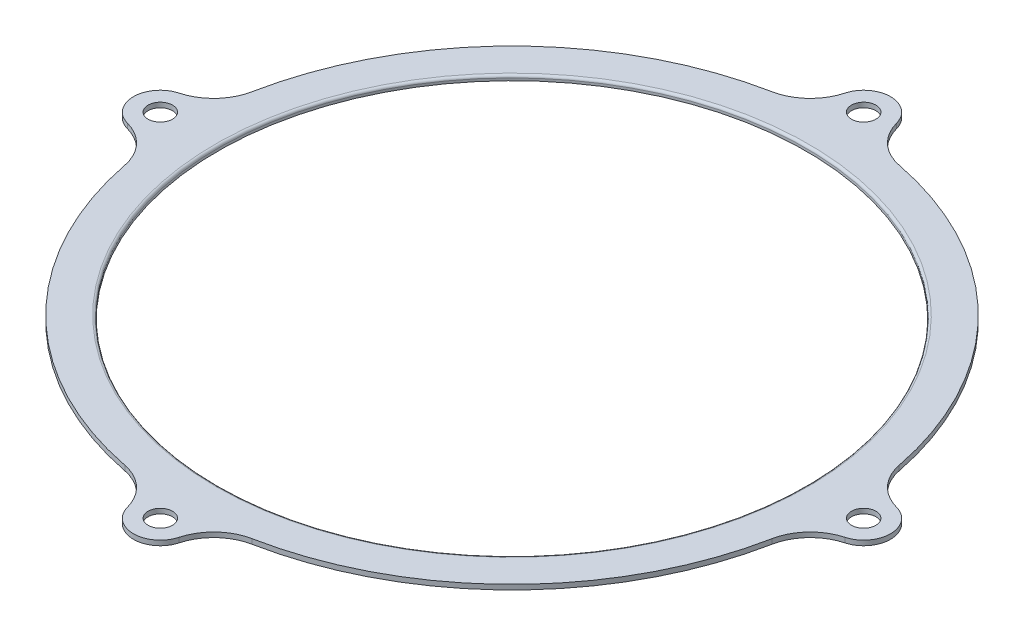
ISO-10303-21;
HEADER;
FILE_DESCRIPTION(('STEP AP214'),'2;1');
FILE_NAME('part.step','',(''),(''),'','','');
FILE_SCHEMA(('AUTOMOTIVE_DESIGN { 1 0 10303 214 1 1 1 1 }'));
ENDSEC;
DATA;
#1=APPLICATION_CONTEXT('core data for automotive mechanical design processes');
#2=APPLICATION_PROTOCOL_DEFINITION('international standard','automotive_design',2000,#1);
#3=PRODUCT_CONTEXT('',#1,'mechanical');
#4=PRODUCT('Part','Part','',(#3));
#5=PRODUCT_RELATED_PRODUCT_CATEGORY('part','',(#4));
#6=PRODUCT_DEFINITION_FORMATION('','',#4);
#7=PRODUCT_DEFINITION_CONTEXT('part definition',#1,'design');
#8=PRODUCT_DEFINITION('design','',#6,#7);
#9=PRODUCT_DEFINITION_SHAPE('','',#8);
#10=(LENGTH_UNIT() NAMED_UNIT(*) SI_UNIT(.MILLI.,.METRE.));
#11=(NAMED_UNIT(*) PLANE_ANGLE_UNIT() SI_UNIT($,.RADIAN.));
#12=(NAMED_UNIT(*) SI_UNIT($,.STERADIAN.) SOLID_ANGLE_UNIT());
#13=UNCERTAINTY_MEASURE_WITH_UNIT(LENGTH_MEASURE(1.E-05),#10,'distance_accuracy_value','');
#14=(GEOMETRIC_REPRESENTATION_CONTEXT(3) GLOBAL_UNCERTAINTY_ASSIGNED_CONTEXT((#13)) GLOBAL_UNIT_ASSIGNED_CONTEXT((#10,
#11,#12)) REPRESENTATION_CONTEXT('',''));
#15=CARTESIAN_POINT('',(0.,0.,0.));
#16=DIRECTION('',(0.,0.,1.));
#17=DIRECTION('',(1.,0.,0.));
#18=AXIS2_PLACEMENT_3D('',#15,#16,#17);
#19=CARTESIAN_POINT('',(0.,1.,0.));
#20=DIRECTION('',(0.,-1.,0.));
#21=DIRECTION('',(0.,0.,-1.));
#22=AXIS2_PLACEMENT_3D('',#19,#20,#21);
#23=CYLINDRICAL_SURFACE('',#22,67.5);
#24=DIRECTION('',(0.,-1.,0.));
#25=VECTOR('',#24,1.);
#26=CARTESIAN_POINT('',(-13.0329760411857,199.116127561589,66.2298387096774));
#27=LINE('',#26,#25);
#28=CARTESIAN_POINT('',(-13.0329760411857,1.,66.2298387096774));
#29=VERTEX_POINT('',#28);
#30=CARTESIAN_POINT('',(-13.0329760411857,0.,66.2298387096774));
#31=VERTEX_POINT('',#30);
#32=EDGE_CURVE('E249',#29,#31,#27,.T.);
#33=ORIENTED_EDGE('',*,*,#32,.F.);
#34=CARTESIAN_POINT('',(0.,1.,0.));
#35=DIRECTION('',(0.,1.,0.));
#36=DIRECTION('',(0.,0.,1.));
#37=AXIS2_PLACEMENT_3D('',#34,#35,#36);
#38=CIRCLE('',#37,67.5);
#39=CARTESIAN_POINT('',(-66.2298387096774,1.,13.0329760411855));
#40=VERTEX_POINT('',#39);
#41=EDGE_CURVE('E350',#40,#29,#38,.T.);
#42=ORIENTED_EDGE('',*,*,#41,.F.);
#43=DIRECTION('',(0.,-1.,0.));
#44=VECTOR('',#43,1.);
#45=CARTESIAN_POINT('',(-66.2298387096774,199.116127561589,13.0329760411855));
#46=LINE('',#45,#44);
#47=CARTESIAN_POINT('',(-66.2298387096774,0.,13.0329760411855));
#48=VERTEX_POINT('',#47);
#49=EDGE_CURVE('E58',#40,#48,#46,.T.);
#50=ORIENTED_EDGE('',*,*,#49,.T.);
#51=CARTESIAN_POINT('',(0.,0.,0.));
#52=DIRECTION('',(0.,1.,0.));
#53=DIRECTION('',(0.,0.,1.));
#54=AXIS2_PLACEMENT_3D('',#51,#52,#53);
#55=CIRCLE('',#54,67.5);
#56=EDGE_CURVE('E360',#48,#31,#55,.T.);
#57=ORIENTED_EDGE('',*,*,#56,.T.);
#58=EDGE_LOOP('',(#33,#42,#50,#57));
#59=FACE_BOUND('',#58,.T.);
#60=ADVANCED_FACE('F43',(#59),#23,.T.);
#61=DIRECTION('',(0.,-1.,0.));
#62=VECTOR('',#61,1.);
#63=CARTESIAN_POINT('',(13.0329760411862,199.116127561589,-66.2298387096773));
#64=LINE('',#63,#62);
#65=CARTESIAN_POINT('',(13.0329760411862,1.,-66.2298387096773));
#66=VERTEX_POINT('',#65);
#67=CARTESIAN_POINT('',(13.0329760411862,0.,-66.2298387096773));
#68=VERTEX_POINT('',#67);
#69=EDGE_CURVE('E169',#66,#68,#64,.T.);
#70=ORIENTED_EDGE('',*,*,#69,.F.);
#71=CARTESIAN_POINT('',(66.2298387096774,1.,-13.0329760411855));
#72=VERTEX_POINT('',#71);
#73=EDGE_CURVE('E166',#72,#66,#38,.T.);
#74=ORIENTED_EDGE('',*,*,#73,.F.);
#75=DIRECTION('',(0.,-1.,0.));
#76=VECTOR('',#75,1.);
#77=CARTESIAN_POINT('',(66.2298387096774,199.116127561589,-13.0329760411855));
#78=LINE('',#77,#76);
#79=CARTESIAN_POINT('',(66.2298387096774,0.,-13.0329760411855));
#80=VERTEX_POINT('',#79);
#81=EDGE_CURVE('E288',#72,#80,#78,.T.);
#82=ORIENTED_EDGE('',*,*,#81,.T.);
#83=EDGE_CURVE('E295',#80,#68,#55,.T.);
#84=ORIENTED_EDGE('',*,*,#83,.T.);
#85=EDGE_LOOP('',(#70,#74,#82,#84));
#86=FACE_BOUND('',#85,.T.);
#87=ADVANCED_FACE('F317',(#86),#23,.T.);
#88=CARTESIAN_POINT('',(-13.0329760411848,1.,-66.2298387096776));
#89=VERTEX_POINT('',#88);
#90=CARTESIAN_POINT('',(-66.2298387096774,1.,-13.0329760411855));
#91=VERTEX_POINT('',#90);
#92=EDGE_CURVE('E301',#89,#91,#38,.T.);
#93=ORIENTED_EDGE('',*,*,#92,.F.);
#94=DIRECTION('',(0.,-1.,0.));
#95=VECTOR('',#94,1.);
#96=CARTESIAN_POINT('',(-13.0329760411848,199.116127561589,-66.2298387096776));
#97=LINE('',#96,#95);
#98=CARTESIAN_POINT('',(-13.0329760411848,0.,-66.2298387096776));
#99=VERTEX_POINT('',#98);
#100=EDGE_CURVE('E170',#89,#99,#97,.T.);
#101=ORIENTED_EDGE('',*,*,#100,.T.);
#102=CARTESIAN_POINT('',(-66.2298387096774,0.,-13.0329760411855));
#103=VERTEX_POINT('',#102);
#104=EDGE_CURVE('E298',#99,#103,#55,.T.);
#105=ORIENTED_EDGE('',*,*,#104,.T.);
#106=DIRECTION('',(0.,-1.,0.));
#107=VECTOR('',#106,1.);
#108=CARTESIAN_POINT('',(-66.2298387096774,199.116127561589,-13.0329760411855));
#109=LINE('',#108,#107);
#110=EDGE_CURVE('E216',#91,#103,#109,.T.);
#111=ORIENTED_EDGE('',*,*,#110,.F.);
#112=EDGE_LOOP('',(#93,#101,#105,#111));
#113=FACE_BOUND('',#112,.T.);
#114=ADVANCED_FACE('F323',(#113),#23,.T.);
#115=CARTESIAN_POINT('',(0.,1.,0.));
#116=DIRECTION('',(0.,1.,0.));
#117=DIRECTION('',(0.,0.,1.));
#118=AXIS2_PLACEMENT_3D('',#115,#116,#117);
#119=PLANE('',#118);
#120=CARTESIAN_POINT('',(0.,1.,0.));
#121=DIRECTION('',(0.,1.,0.));
#122=DIRECTION('',(0.,0.,1.));
#123=AXIS2_PLACEMENT_3D('',#120,#121,#122);
#124=CIRCLE('',#123,60.7);
#125=CARTESIAN_POINT('',(0.,1.,60.7));
#126=VERTEX_POINT('',#125);
#127=EDGE_CURVE('E51',#126,#126,#124,.F.);
#128=ORIENTED_EDGE('',*,*,#127,.T.);
#129=EDGE_LOOP('',(#128));
#130=FACE_BOUND('',#129,.T.);
#131=CARTESIAN_POINT('',(13.0329760411852,1.,66.2298387096775));
#132=VERTEX_POINT('',#131);
#133=CARTESIAN_POINT('',(66.2298387096774,1.,13.0329760411855));
#134=VERTEX_POINT('',#133);
#135=EDGE_CURVE('E277',#132,#134,#38,.T.);
#136=ORIENTED_EDGE('',*,*,#135,.T.);
#137=CARTESIAN_POINT('',(76.0416666666667,1.,14.9637873065463));
#138=DIRECTION('',(0.,1.,0.));
#139=DIRECTION('',(0.,0.,1.));
#140=AXIS2_PLACEMENT_3D('',#137,#138,#139);
#141=CIRCLE('',#140,10.);
#142=CARTESIAN_POINT('',(73.4341397849462,1.,5.30973097974223));
#143=VERTEX_POINT('',#142);
#144=EDGE_CURVE('E285',#143,#134,#141,.T.);
#145=ORIENTED_EDGE('',*,*,#144,.F.);
#146=CARTESIAN_POINT('',(72.,1.,0.));
#147=DIRECTION('',(0.,1.,0.));
#148=DIRECTION('',(0.,0.,1.));
#149=AXIS2_PLACEMENT_3D('',#146,#147,#148);
#150=CIRCLE('',#149,5.5);
#151=CARTESIAN_POINT('',(73.4341397849462,1.,-5.30973097974223));
#152=VERTEX_POINT('',#151);
#153=EDGE_CURVE('E278',#152,#143,#150,.F.);
#154=ORIENTED_EDGE('',*,*,#153,.F.);
#155=CARTESIAN_POINT('',(76.0416666666667,1.,-14.9637873065463));
#156=DIRECTION('',(0.,1.,0.));
#157=DIRECTION('',(0.,0.,1.));
#158=AXIS2_PLACEMENT_3D('',#155,#156,#157);
#159=CIRCLE('',#158,10.);
#160=EDGE_CURVE('E245',#72,#152,#159,.T.);
#161=ORIENTED_EDGE('',*,*,#160,.F.);
#162=ORIENTED_EDGE('',*,*,#73,.T.);
#163=CARTESIAN_POINT('',(14.9637873065471,1.,-76.0416666666665));
#164=DIRECTION('',(0.,1.,0.));
#165=DIRECTION('',(0.,0.,1.));
#166=AXIS2_PLACEMENT_3D('',#163,#164,#165);
#167=CIRCLE('',#166,10.);
#168=CARTESIAN_POINT('',(5.309730979743,1.,-73.4341397849462));
#169=VERTEX_POINT('',#168);
#170=EDGE_CURVE('E157',#169,#66,#167,.T.);
#171=ORIENTED_EDGE('',*,*,#170,.F.);
#172=CARTESIAN_POINT('',(7.54159969190117E-13,1.,-72.));
#173=DIRECTION('',(0.,1.,0.));
#174=DIRECTION('',(0.,0.,1.));
#175=AXIS2_PLACEMENT_3D('',#172,#173,#174);
#176=CIRCLE('',#175,5.5);
#177=CARTESIAN_POINT('',(-5.30973097974146,1.,-73.4341397849463));
#178=VERTEX_POINT('',#177);
#179=EDGE_CURVE('E162',#178,#169,#176,.F.);
#180=ORIENTED_EDGE('',*,*,#179,.F.);
#181=CARTESIAN_POINT('',(-14.9637873065455,1.,-76.0416666666668));
#182=DIRECTION('',(0.,1.,0.));
#183=DIRECTION('',(0.,0.,1.));
#184=AXIS2_PLACEMENT_3D('',#181,#182,#183);
#185=CIRCLE('',#184,10.);
#186=EDGE_CURVE('E191',#89,#178,#185,.T.);
#187=ORIENTED_EDGE('',*,*,#186,.F.);
#188=ORIENTED_EDGE('',*,*,#92,.T.);
#189=CARTESIAN_POINT('',(-76.0416666666667,1.,-14.9637873065463));
#190=DIRECTION('',(0.,1.,0.));
#191=DIRECTION('',(0.,0.,1.));
#192=AXIS2_PLACEMENT_3D('',#189,#190,#191);
#193=CIRCLE('',#192,10.);
#194=CARTESIAN_POINT('',(-73.4341397849462,1.,-5.30973097974223));
#195=VERTEX_POINT('',#194);
#196=EDGE_CURVE('E221',#195,#91,#193,.T.);
#197=ORIENTED_EDGE('',*,*,#196,.F.);
#198=CARTESIAN_POINT('',(-72.,1.,0.));
#199=DIRECTION('',(0.,1.,0.));
#200=DIRECTION('',(0.,0.,1.));
#201=AXIS2_PLACEMENT_3D('',#198,#199,#200);
#202=CIRCLE('',#201,5.5);
#203=CARTESIAN_POINT('',(-73.4341397849462,1.,5.30973097974223));
#204=VERTEX_POINT('',#203);
#205=EDGE_CURVE('E213',#204,#195,#202,.F.);
#206=ORIENTED_EDGE('',*,*,#205,.F.);
#207=CARTESIAN_POINT('',(-76.0416666666667,1.,14.9637873065463));
#208=DIRECTION('',(0.,1.,0.));
#209=DIRECTION('',(0.,0.,1.));
#210=AXIS2_PLACEMENT_3D('',#207,#208,#209);
#211=CIRCLE('',#210,10.);
#212=EDGE_CURVE('E217',#40,#204,#211,.T.);
#213=ORIENTED_EDGE('',*,*,#212,.F.);
#214=ORIENTED_EDGE('',*,*,#41,.T.);
#215=CARTESIAN_POINT('',(-14.9637873065465,1.,76.0416666666666));
#216=DIRECTION('',(0.,1.,0.));
#217=DIRECTION('',(0.,0.,1.));
#218=AXIS2_PLACEMENT_3D('',#215,#216,#217);
#219=CIRCLE('',#218,10.);
#220=CARTESIAN_POINT('',(-5.30973097974249,1.,73.4341397849462));
#221=VERTEX_POINT('',#220);
#222=EDGE_CURVE('E253',#221,#29,#219,.T.);
#223=ORIENTED_EDGE('',*,*,#222,.F.);
#224=CARTESIAN_POINT('',(-2.51386656396706E-13,1.,72.));
#225=DIRECTION('',(0.,1.,0.));
#226=DIRECTION('',(0.,0.,1.));
#227=AXIS2_PLACEMENT_3D('',#224,#225,#226);
#228=CIRCLE('',#227,5.5);
#229=CARTESIAN_POINT('',(5.30973097974197,1.,73.4341397849462));
#230=VERTEX_POINT('',#229);
#231=EDGE_CURVE('E246',#230,#221,#228,.F.);
#232=ORIENTED_EDGE('',*,*,#231,.F.);
#233=CARTESIAN_POINT('',(14.963787306546,1.,76.0416666666667));
#234=DIRECTION('',(0.,1.,0.));
#235=DIRECTION('',(0.,0.,1.));
#236=AXIS2_PLACEMENT_3D('',#233,#234,#235);
#237=CIRCLE('',#236,10.);
#238=EDGE_CURVE('E212',#132,#230,#237,.T.);
#239=ORIENTED_EDGE('',*,*,#238,.F.);
#240=EDGE_LOOP('',(#136,#145,#154,#161,#162,#171,#180,#187,#188,#197,#206,#213,#214,#223,#232,#239));
#241=FACE_BOUND('',#240,.T.);
#242=CARTESIAN_POINT('',(-2.51386656396706E-13,1.,72.));
#243=DIRECTION('',(0.,1.,0.));
#244=DIRECTION('',(0.,0.,1.));
#245=AXIS2_PLACEMENT_3D('',#242,#243,#244);
#246=CIRCLE('',#245,2.49999999999999);
#247=CARTESIAN_POINT('',(-2.51386656396706E-13,1.,74.5));
#248=VERTEX_POINT('',#247);
#249=EDGE_CURVE('E232',#248,#248,#246,.F.);
#250=ORIENTED_EDGE('',*,*,#249,.T.);
#251=EDGE_LOOP('',(#250));
#252=FACE_BOUND('',#251,.T.);
#253=CARTESIAN_POINT('',(-72.,1.,0.));
#254=DIRECTION('',(0.,1.,0.));
#255=DIRECTION('',(0.,0.,1.));
#256=AXIS2_PLACEMENT_3D('',#253,#254,#255);
#257=CIRCLE('',#256,2.49999999999999);
#258=CARTESIAN_POINT('',(-72.,1.,2.49999999999999));
#259=VERTEX_POINT('',#258);
#260=EDGE_CURVE('E199',#259,#259,#257,.F.);
#261=ORIENTED_EDGE('',*,*,#260,.T.);
#262=EDGE_LOOP('',(#261));
#263=FACE_BOUND('',#262,.T.);
#264=CARTESIAN_POINT('',(7.54159969190117E-13,1.,-72.));
#265=DIRECTION('',(0.,1.,0.));
#266=DIRECTION('',(0.,0.,1.));
#267=AXIS2_PLACEMENT_3D('',#264,#265,#266);
#268=CIRCLE('',#267,2.49999999999999);
#269=CARTESIAN_POINT('',(7.54159969190117E-13,1.,-69.5));
#270=VERTEX_POINT('',#269);
#271=EDGE_CURVE('E189',#270,#270,#268,.F.);
#272=ORIENTED_EDGE('',*,*,#271,.T.);
#273=EDGE_LOOP('',(#272));
#274=FACE_BOUND('',#273,.T.);
#275=CARTESIAN_POINT('',(72.,1.,0.));
#276=DIRECTION('',(0.,1.,0.));
#277=DIRECTION('',(0.,0.,1.));
#278=AXIS2_PLACEMENT_3D('',#275,#276,#277);
#279=CIRCLE('',#278,2.49999999999999);
#280=CARTESIAN_POINT('',(72.,1.,2.49999999999999));
#281=VERTEX_POINT('',#280);
#282=EDGE_CURVE('E264',#281,#281,#279,.F.);
#283=ORIENTED_EDGE('',*,*,#282,.T.);
#284=EDGE_LOOP('',(#283));
#285=FACE_BOUND('',#284,.T.);
#286=ADVANCED_FACE('F159',(#130,#241,#252,#263,#274,#285),#119,.T.);
#287=CARTESIAN_POINT('',(0.,0.,0.));
#288=DIRECTION('',(0.,1.,0.));
#289=DIRECTION('',(0.,0.,1.));
#290=AXIS2_PLACEMENT_3D('',#287,#288,#289);
#291=PLANE('',#290);
#292=CARTESIAN_POINT('',(0.,0.,0.));
#293=DIRECTION('',(0.,1.,0.));
#294=DIRECTION('',(0.,0.,1.));
#295=AXIS2_PLACEMENT_3D('',#292,#293,#294);
#296=CIRCLE('',#295,60.2);
#297=CARTESIAN_POINT('',(0.,0.,60.2));
#298=VERTEX_POINT('',#297);
#299=EDGE_CURVE('E192',#298,#298,#296,.T.);
#300=ORIENTED_EDGE('',*,*,#299,.T.);
#301=EDGE_LOOP('',(#300));
#302=FACE_BOUND('',#301,.T.);
#303=ORIENTED_EDGE('',*,*,#83,.F.);
#304=CARTESIAN_POINT('',(76.0416666666667,0.,-14.9637873065463));
#305=DIRECTION('',(0.,1.,0.));
#306=DIRECTION('',(0.,0.,1.));
#307=AXIS2_PLACEMENT_3D('',#304,#305,#306);
#308=CIRCLE('',#307,10.);
#309=CARTESIAN_POINT('',(73.4341397849462,0.,-5.30973097974223));
#310=VERTEX_POINT('',#309);
#311=EDGE_CURVE('E268',#80,#310,#308,.T.);
#312=ORIENTED_EDGE('',*,*,#311,.T.);
#313=CARTESIAN_POINT('',(72.,0.,0.));
#314=DIRECTION('',(0.,-1.,0.));
#315=DIRECTION('',(0.,0.,-1.));
#316=AXIS2_PLACEMENT_3D('',#313,#314,#315);
#317=CIRCLE('',#316,5.5);
#318=CARTESIAN_POINT('',(73.4341397849462,0.,5.30973097974223));
#319=VERTEX_POINT('',#318);
#320=EDGE_CURVE('E265',#310,#319,#317,.T.);
#321=ORIENTED_EDGE('',*,*,#320,.T.);
#322=CARTESIAN_POINT('',(76.0416666666667,0.,14.9637873065463));
#323=DIRECTION('',(0.,1.,0.));
#324=DIRECTION('',(0.,0.,-1.));
#325=AXIS2_PLACEMENT_3D('',#322,#323,#324);
#326=CIRCLE('',#325,10.);
#327=CARTESIAN_POINT('',(66.2298387096774,0.,13.0329760411855));
#328=VERTEX_POINT('',#327);
#329=EDGE_CURVE('E261',#319,#328,#326,.T.);
#330=ORIENTED_EDGE('',*,*,#329,.T.);
#331=CARTESIAN_POINT('',(13.0329760411852,0.,66.2298387096775));
#332=VERTEX_POINT('',#331);
#333=EDGE_CURVE('E299',#332,#328,#55,.T.);
#334=ORIENTED_EDGE('',*,*,#333,.F.);
#335=CARTESIAN_POINT('',(14.963787306546,0.,76.0416666666667));
#336=DIRECTION('',(0.,1.,0.));
#337=DIRECTION('',(-1.,0.,0.));
#338=AXIS2_PLACEMENT_3D('',#335,#336,#337);
#339=CIRCLE('',#338,10.);
#340=CARTESIAN_POINT('',(5.30973097974197,0.,73.4341397849462));
#341=VERTEX_POINT('',#340);
#342=EDGE_CURVE('E236',#332,#341,#339,.T.);
#343=ORIENTED_EDGE('',*,*,#342,.T.);
#344=CARTESIAN_POINT('',(-2.51386656396706E-13,0.,72.));
#345=DIRECTION('',(0.,-1.,0.));
#346=DIRECTION('',(1.,0.,0.));
#347=AXIS2_PLACEMENT_3D('',#344,#345,#346);
#348=CIRCLE('',#347,5.5);
#349=CARTESIAN_POINT('',(-5.30973097974249,0.,73.4341397849462));
#350=VERTEX_POINT('',#349);
#351=EDGE_CURVE('E233',#341,#350,#348,.T.);
#352=ORIENTED_EDGE('',*,*,#351,.T.);
#353=CARTESIAN_POINT('',(-14.9637873065465,0.,76.0416666666666));
#354=DIRECTION('',(0.,1.,0.));
#355=DIRECTION('',(1.,0.,0.));
#356=AXIS2_PLACEMENT_3D('',#353,#354,#355);
#357=CIRCLE('',#356,10.);
#358=EDGE_CURVE('E229',#350,#31,#357,.T.);
#359=ORIENTED_EDGE('',*,*,#358,.T.);
#360=ORIENTED_EDGE('',*,*,#56,.F.);
#361=CARTESIAN_POINT('',(-76.0416666666667,0.,14.9637873065463));
#362=DIRECTION('',(0.,1.,0.));
#363=DIRECTION('',(0.,0.,-1.));
#364=AXIS2_PLACEMENT_3D('',#361,#362,#363);
#365=CIRCLE('',#364,10.);
#366=CARTESIAN_POINT('',(-73.4341397849462,0.,5.30973097974223));
#367=VERTEX_POINT('',#366);
#368=EDGE_CURVE('E203',#48,#367,#365,.T.);
#369=ORIENTED_EDGE('',*,*,#368,.T.);
#370=CARTESIAN_POINT('',(-72.,0.,0.));
#371=DIRECTION('',(0.,-1.,0.));
#372=DIRECTION('',(0.,0.,1.));
#373=AXIS2_PLACEMENT_3D('',#370,#371,#372);
#374=CIRCLE('',#373,5.5);
#375=CARTESIAN_POINT('',(-73.4341397849462,0.,-5.30973097974223));
#376=VERTEX_POINT('',#375);
#377=EDGE_CURVE('E200',#367,#376,#374,.T.);
#378=ORIENTED_EDGE('',*,*,#377,.T.);
#379=CARTESIAN_POINT('',(-76.0416666666667,0.,-14.9637873065463));
#380=DIRECTION('',(0.,1.,0.));
#381=DIRECTION('',(0.,0.,1.));
#382=AXIS2_PLACEMENT_3D('',#379,#380,#381);
#383=CIRCLE('',#382,10.);
#384=EDGE_CURVE('E196',#376,#103,#383,.T.);
#385=ORIENTED_EDGE('',*,*,#384,.T.);
#386=ORIENTED_EDGE('',*,*,#104,.F.);
#387=CARTESIAN_POINT('',(-14.9637873065455,0.,-76.0416666666668));
#388=DIRECTION('',(0.,1.,0.));
#389=DIRECTION('',(1.,0.,0.));
#390=AXIS2_PLACEMENT_3D('',#387,#388,#389);
#391=CIRCLE('',#390,10.);
#392=CARTESIAN_POINT('',(-5.30973097974146,0.,-73.4341397849463));
#393=VERTEX_POINT('',#392);
#394=EDGE_CURVE('E66',#99,#393,#391,.T.);
#395=ORIENTED_EDGE('',*,*,#394,.T.);
#396=CARTESIAN_POINT('',(7.54159969190117E-13,0.,-72.));
#397=DIRECTION('',(0.,-1.,0.));
#398=DIRECTION('',(-1.,0.,0.));
#399=AXIS2_PLACEMENT_3D('',#396,#397,#398);
#400=CIRCLE('',#399,5.5);
#401=CARTESIAN_POINT('',(5.309730979743,0.,-73.4341397849462));
#402=VERTEX_POINT('',#401);
#403=EDGE_CURVE('E596',#393,#402,#400,.T.);
#404=ORIENTED_EDGE('',*,*,#403,.T.);
#405=CARTESIAN_POINT('',(14.9637873065471,0.,-76.0416666666665));
#406=DIRECTION('',(0.,1.,0.));
#407=DIRECTION('',(-1.,0.,0.));
#408=AXIS2_PLACEMENT_3D('',#405,#406,#407);
#409=CIRCLE('',#408,10.);
#410=EDGE_CURVE('E176',#402,#68,#409,.T.);
#411=ORIENTED_EDGE('',*,*,#410,.T.);
#412=EDGE_LOOP('',(#303,#312,#321,#330,#334,#343,#352,#359,#360,#369,#378,#385,#386,#395,#404,#411));
#413=FACE_BOUND('',#412,.T.);
#414=CARTESIAN_POINT('',(-2.51386656396706E-13,0.,72.));
#415=DIRECTION('',(0.,-1.,0.));
#416=DIRECTION('',(1.,0.,0.));
#417=AXIS2_PLACEMENT_3D('',#414,#415,#416);
#418=CIRCLE('',#417,2.49999999999999);
#419=CARTESIAN_POINT('',(2.49999999999974,0.,72.));
#420=VERTEX_POINT('',#419);
#421=EDGE_CURVE('E239',#420,#420,#418,.T.);
#422=ORIENTED_EDGE('',*,*,#421,.F.);
#423=EDGE_LOOP('',(#422));
#424=FACE_BOUND('',#423,.T.);
#425=CARTESIAN_POINT('',(-72.,0.,0.));
#426=DIRECTION('',(0.,-1.,0.));
#427=DIRECTION('',(0.,0.,1.));
#428=AXIS2_PLACEMENT_3D('',#425,#426,#427);
#429=CIRCLE('',#428,2.49999999999999);
#430=CARTESIAN_POINT('',(-72.,0.,2.49999999999999));
#431=VERTEX_POINT('',#430);
#432=EDGE_CURVE('E206',#431,#431,#429,.T.);
#433=ORIENTED_EDGE('',*,*,#432,.F.);
#434=EDGE_LOOP('',(#433));
#435=FACE_BOUND('',#434,.T.);
#436=CARTESIAN_POINT('',(7.54159969190117E-13,0.,-72.));
#437=DIRECTION('',(0.,-1.,0.));
#438=DIRECTION('',(-1.,0.,0.));
#439=AXIS2_PLACEMENT_3D('',#436,#437,#438);
#440=CIRCLE('',#439,2.49999999999999);
#441=CARTESIAN_POINT('',(-2.49999999999924,0.,-72.));
#442=VERTEX_POINT('',#441);
#443=EDGE_CURVE('E180',#442,#442,#440,.T.);
#444=ORIENTED_EDGE('',*,*,#443,.F.);
#445=EDGE_LOOP('',(#444));
#446=FACE_BOUND('',#445,.T.);
#447=CARTESIAN_POINT('',(72.,0.,0.));
#448=DIRECTION('',(0.,-1.,0.));
#449=DIRECTION('',(0.,0.,-1.));
#450=AXIS2_PLACEMENT_3D('',#447,#448,#449);
#451=CIRCLE('',#450,2.49999999999999);
#452=CARTESIAN_POINT('',(72.,0.,-2.49999999999999));
#453=VERTEX_POINT('',#452);
#454=EDGE_CURVE('E271',#453,#453,#451,.T.);
#455=ORIENTED_EDGE('',*,*,#454,.F.);
#456=EDGE_LOOP('',(#455));
#457=FACE_BOUND('',#456,.T.);
#458=ADVANCED_FACE('F330',(#302,#413,#424,#435,#446,#457),#291,.F.);
#459=ORIENTED_EDGE('',*,*,#135,.F.);
#460=DIRECTION('',(0.,-1.,0.));
#461=VECTOR('',#460,1.);
#462=CARTESIAN_POINT('',(13.0329760411852,199.116127561589,66.2298387096775));
#463=LINE('',#462,#461);
#464=EDGE_CURVE('E255',#132,#332,#463,.T.);
#465=ORIENTED_EDGE('',*,*,#464,.T.);
#466=ORIENTED_EDGE('',*,*,#333,.T.);
#467=DIRECTION('',(0.,-1.,0.));
#468=VECTOR('',#467,1.);
#469=CARTESIAN_POINT('',(66.2298387096774,199.116127561589,13.0329760411855));
#470=LINE('',#469,#468);
#471=EDGE_CURVE('E281',#134,#328,#470,.T.);
#472=ORIENTED_EDGE('',*,*,#471,.F.);
#473=EDGE_LOOP('',(#459,#465,#466,#472));
#474=FACE_BOUND('',#473,.T.);
#475=ADVANCED_FACE('F319',(#474),#23,.T.);
#476=CARTESIAN_POINT('',(76.0416666666667,199.116127561589,-14.9637873065463));
#477=DIRECTION('',(0.,-1.,0.));
#478=DIRECTION('',(0.,0.,-1.));
#479=AXIS2_PLACEMENT_3D('',#476,#477,#478);
#480=CYLINDRICAL_SURFACE('',#479,10.);
#481=ORIENTED_EDGE('',*,*,#81,.F.);
#482=ORIENTED_EDGE('',*,*,#160,.T.);
#483=DIRECTION('',(0.,-1.,0.));
#484=VECTOR('',#483,1.);
#485=CARTESIAN_POINT('',(73.4341397849462,199.116127561589,-5.30973097974223));
#486=LINE('',#485,#484);
#487=EDGE_CURVE('E284',#152,#310,#486,.T.);
#488=ORIENTED_EDGE('',*,*,#487,.T.);
#489=ORIENTED_EDGE('',*,*,#311,.F.);
#490=EDGE_LOOP('',(#481,#482,#488,#489));
#491=FACE_BOUND('',#490,.T.);
#492=ADVANCED_FACE('F329',(#491),#480,.F.);
#493=CARTESIAN_POINT('',(76.0416666666667,199.116127561589,14.9637873065463));
#494=DIRECTION('',(0.,-1.,0.));
#495=DIRECTION('',(0.,0.,-1.));
#496=AXIS2_PLACEMENT_3D('',#493,#494,#495);
#497=CYLINDRICAL_SURFACE('',#496,10.);
#498=DIRECTION('',(0.,-1.,0.));
#499=VECTOR('',#498,1.);
#500=CARTESIAN_POINT('',(73.4341397849462,199.116127561589,5.30973097974223));
#501=LINE('',#500,#499);
#502=EDGE_CURVE('E274',#143,#319,#501,.T.);
#503=ORIENTED_EDGE('',*,*,#502,.F.);
#504=ORIENTED_EDGE('',*,*,#144,.T.);
#505=ORIENTED_EDGE('',*,*,#471,.T.);
#506=ORIENTED_EDGE('',*,*,#329,.F.);
#507=EDGE_LOOP('',(#503,#504,#505,#506));
#508=FACE_BOUND('',#507,.T.);
#509=ADVANCED_FACE('F336',(#508),#497,.F.);
#510=CARTESIAN_POINT('',(72.,199.116127561589,0.));
#511=DIRECTION('',(0.,-1.,0.));
#512=DIRECTION('',(0.,0.,-1.));
#513=AXIS2_PLACEMENT_3D('',#510,#511,#512);
#514=CYLINDRICAL_SURFACE('',#513,5.5);
#515=ORIENTED_EDGE('',*,*,#487,.F.);
#516=ORIENTED_EDGE('',*,*,#153,.T.);
#517=ORIENTED_EDGE('',*,*,#502,.T.);
#518=ORIENTED_EDGE('',*,*,#320,.F.);
#519=EDGE_LOOP('',(#515,#516,#517,#518));
#520=FACE_BOUND('',#519,.T.);
#521=ADVANCED_FACE('F405',(#520),#514,.T.);
#522=CARTESIAN_POINT('',(72.,199.116127561589,0.));
#523=DIRECTION('',(0.,-1.,0.));
#524=DIRECTION('',(0.,0.,-1.));
#525=AXIS2_PLACEMENT_3D('',#522,#523,#524);
#526=CYLINDRICAL_SURFACE('',#525,2.49999999999999);
#527=ORIENTED_EDGE('',*,*,#454,.T.);
#528=EDGE_LOOP('',(#527));
#529=FACE_BOUND('',#528,.T.);
#530=ORIENTED_EDGE('',*,*,#282,.F.);
#531=EDGE_LOOP('',(#530));
#532=FACE_BOUND('',#531,.T.);
#533=ADVANCED_FACE('F387',(#529,#532),#526,.F.);
#534=CARTESIAN_POINT('',(-72.,199.116127561589,0.));
#535=DIRECTION('',(0.,-1.,0.));
#536=DIRECTION('',(0.,0.,-1.));
#537=AXIS2_PLACEMENT_3D('',#534,#535,#536);
#538=CYLINDRICAL_SURFACE('',#537,2.49999999999999);
#539=ORIENTED_EDGE('',*,*,#432,.T.);
#540=EDGE_LOOP('',(#539));
#541=FACE_BOUND('',#540,.T.);
#542=ORIENTED_EDGE('',*,*,#260,.F.);
#543=EDGE_LOOP('',(#542));
#544=FACE_BOUND('',#543,.T.);
#545=ADVANCED_FACE('F382',(#541,#544),#538,.F.);
#546=CARTESIAN_POINT('',(-72.,199.116127561589,0.));
#547=DIRECTION('',(0.,-1.,0.));
#548=DIRECTION('',(0.,0.,-1.));
#549=AXIS2_PLACEMENT_3D('',#546,#547,#548);
#550=CYLINDRICAL_SURFACE('',#549,5.5);
#551=DIRECTION('',(0.,-1.,0.));
#552=VECTOR('',#551,1.);
#553=CARTESIAN_POINT('',(-73.4341397849462,199.116127561589,5.30973097974223));
#554=LINE('',#553,#552);
#555=EDGE_CURVE('E220',#204,#367,#554,.T.);
#556=ORIENTED_EDGE('',*,*,#555,.F.);
#557=ORIENTED_EDGE('',*,*,#205,.T.);
#558=DIRECTION('',(0.,-1.,0.));
#559=VECTOR('',#558,1.);
#560=CARTESIAN_POINT('',(-73.4341397849462,199.116127561589,-5.30973097974223));
#561=LINE('',#560,#559);
#562=EDGE_CURVE('E209',#195,#376,#561,.T.);
#563=ORIENTED_EDGE('',*,*,#562,.T.);
#564=ORIENTED_EDGE('',*,*,#377,.F.);
#565=EDGE_LOOP('',(#556,#557,#563,#564));
#566=FACE_BOUND('',#565,.T.);
#567=ADVANCED_FACE('F371',(#566),#550,.T.);
#568=CARTESIAN_POINT('',(-76.0416666666667,199.116127561589,14.9637873065463));
#569=DIRECTION('',(0.,-1.,0.));
#570=DIRECTION('',(0.,0.,-1.));
#571=AXIS2_PLACEMENT_3D('',#568,#569,#570);
#572=CYLINDRICAL_SURFACE('',#571,10.);
#573=ORIENTED_EDGE('',*,*,#49,.F.);
#574=ORIENTED_EDGE('',*,*,#212,.T.);
#575=ORIENTED_EDGE('',*,*,#555,.T.);
#576=ORIENTED_EDGE('',*,*,#368,.F.);
#577=EDGE_LOOP('',(#573,#574,#575,#576));
#578=FACE_BOUND('',#577,.T.);
#579=ADVANCED_FACE('F373',(#578),#572,.F.);
#580=CARTESIAN_POINT('',(-76.0416666666667,199.116127561589,-14.9637873065463));
#581=DIRECTION('',(0.,-1.,0.));
#582=DIRECTION('',(0.,0.,-1.));
#583=AXIS2_PLACEMENT_3D('',#580,#581,#582);
#584=CYLINDRICAL_SURFACE('',#583,10.);
#585=ORIENTED_EDGE('',*,*,#562,.F.);
#586=ORIENTED_EDGE('',*,*,#196,.T.);
#587=ORIENTED_EDGE('',*,*,#110,.T.);
#588=ORIENTED_EDGE('',*,*,#384,.F.);
#589=EDGE_LOOP('',(#585,#586,#587,#588));
#590=FACE_BOUND('',#589,.T.);
#591=ADVANCED_FACE('F364',(#590),#584,.F.);
#592=CARTESIAN_POINT('',(-14.9637873065455,199.116127561589,-76.0416666666668));
#593=DIRECTION('',(0.,-1.,0.));
#594=DIRECTION('',(0.,0.,-1.));
#595=AXIS2_PLACEMENT_3D('',#592,#593,#594);
#596=CYLINDRICAL_SURFACE('',#595,10.);
#597=ORIENTED_EDGE('',*,*,#100,.F.);
#598=ORIENTED_EDGE('',*,*,#186,.T.);
#599=DIRECTION('',(0.,-1.,0.));
#600=VECTOR('',#599,1.);
#601=CARTESIAN_POINT('',(-5.30973097974146,199.116127561589,-73.4341397849463));
#602=LINE('',#601,#600);
#603=EDGE_CURVE('E184',#178,#393,#602,.T.);
#604=ORIENTED_EDGE('',*,*,#603,.T.);
#605=ORIENTED_EDGE('',*,*,#394,.F.);
#606=EDGE_LOOP('',(#597,#598,#604,#605));
#607=FACE_BOUND('',#606,.T.);
#608=ADVANCED_FACE('F380',(#607),#596,.F.);
#609=CARTESIAN_POINT('',(14.9637873065471,199.116127561589,-76.0416666666665));
#610=DIRECTION('',(0.,-1.,0.));
#611=DIRECTION('',(0.,0.,-1.));
#612=AXIS2_PLACEMENT_3D('',#609,#610,#611);
#613=CYLINDRICAL_SURFACE('',#612,10.);
#614=DIRECTION('',(0.,-1.,0.));
#615=VECTOR('',#614,1.);
#616=CARTESIAN_POINT('',(5.309730979743,199.116127561589,-73.4341397849462));
#617=LINE('',#616,#615);
#618=EDGE_CURVE('E173',#169,#402,#617,.T.);
#619=ORIENTED_EDGE('',*,*,#618,.F.);
#620=ORIENTED_EDGE('',*,*,#170,.T.);
#621=ORIENTED_EDGE('',*,*,#69,.T.);
#622=ORIENTED_EDGE('',*,*,#410,.F.);
#623=EDGE_LOOP('',(#619,#620,#621,#622));
#624=FACE_BOUND('',#623,.T.);
#625=ADVANCED_FACE('F174',(#624),#613,.F.);
#626=CARTESIAN_POINT('',(7.54159969190117E-13,199.116127561589,-72.));
#627=DIRECTION('',(0.,-1.,0.));
#628=DIRECTION('',(0.,0.,-1.));
#629=AXIS2_PLACEMENT_3D('',#626,#627,#628);
#630=CYLINDRICAL_SURFACE('',#629,5.5);
#631=ORIENTED_EDGE('',*,*,#603,.F.);
#632=ORIENTED_EDGE('',*,*,#179,.T.);
#633=ORIENTED_EDGE('',*,*,#618,.T.);
#634=ORIENTED_EDGE('',*,*,#403,.F.);
#635=EDGE_LOOP('',(#631,#632,#633,#634));
#636=FACE_BOUND('',#635,.T.);
#637=ADVANCED_FACE('F183',(#636),#630,.T.);
#638=CARTESIAN_POINT('',(7.54159969190117E-13,199.116127561589,-72.));
#639=DIRECTION('',(0.,-1.,0.));
#640=DIRECTION('',(0.,0.,-1.));
#641=AXIS2_PLACEMENT_3D('',#638,#639,#640);
#642=CYLINDRICAL_SURFACE('',#641,2.49999999999999);
#643=ORIENTED_EDGE('',*,*,#443,.T.);
#644=EDGE_LOOP('',(#643));
#645=FACE_BOUND('',#644,.T.);
#646=ORIENTED_EDGE('',*,*,#271,.F.);
#647=EDGE_LOOP('',(#646));
#648=FACE_BOUND('',#647,.T.);
#649=ADVANCED_FACE('F400',(#645,#648),#642,.F.);
#650=CARTESIAN_POINT('',(14.963787306546,199.116127561589,76.0416666666667));
#651=DIRECTION('',(0.,-1.,0.));
#652=DIRECTION('',(0.,0.,-1.));
#653=AXIS2_PLACEMENT_3D('',#650,#651,#652);
#654=CYLINDRICAL_SURFACE('',#653,10.);
#655=ORIENTED_EDGE('',*,*,#464,.F.);
#656=ORIENTED_EDGE('',*,*,#238,.T.);
#657=DIRECTION('',(0.,-1.,0.));
#658=VECTOR('',#657,1.);
#659=CARTESIAN_POINT('',(5.30973097974197,199.116127561589,73.4341397849462));
#660=LINE('',#659,#658);
#661=EDGE_CURVE('E252',#230,#341,#660,.T.);
#662=ORIENTED_EDGE('',*,*,#661,.T.);
#663=ORIENTED_EDGE('',*,*,#342,.F.);
#664=EDGE_LOOP('',(#655,#656,#662,#663));
#665=FACE_BOUND('',#664,.T.);
#666=ADVANCED_FACE('F396',(#665),#654,.F.);
#667=CARTESIAN_POINT('',(-14.9637873065465,199.116127561589,76.0416666666666));
#668=DIRECTION('',(0.,-1.,0.));
#669=DIRECTION('',(0.,0.,-1.));
#670=AXIS2_PLACEMENT_3D('',#667,#668,#669);
#671=CYLINDRICAL_SURFACE('',#670,10.);
#672=DIRECTION('',(0.,-1.,0.));
#673=VECTOR('',#672,1.);
#674=CARTESIAN_POINT('',(-5.30973097974249,199.116127561589,73.4341397849462));
#675=LINE('',#674,#673);
#676=EDGE_CURVE('E242',#221,#350,#675,.T.);
#677=ORIENTED_EDGE('',*,*,#676,.F.);
#678=ORIENTED_EDGE('',*,*,#222,.T.);
#679=ORIENTED_EDGE('',*,*,#32,.T.);
#680=ORIENTED_EDGE('',*,*,#358,.F.);
#681=EDGE_LOOP('',(#677,#678,#679,#680));
#682=FACE_BOUND('',#681,.T.);
#683=ADVANCED_FACE('F392',(#682),#671,.F.);
#684=CARTESIAN_POINT('',(-2.51386656396706E-13,199.116127561589,72.));
#685=DIRECTION('',(0.,-1.,0.));
#686=DIRECTION('',(0.,0.,-1.));
#687=AXIS2_PLACEMENT_3D('',#684,#685,#686);
#688=CYLINDRICAL_SURFACE('',#687,5.5);
#689=ORIENTED_EDGE('',*,*,#661,.F.);
#690=ORIENTED_EDGE('',*,*,#231,.T.);
#691=ORIENTED_EDGE('',*,*,#676,.T.);
#692=ORIENTED_EDGE('',*,*,#351,.F.);
#693=EDGE_LOOP('',(#689,#690,#691,#692));
#694=FACE_BOUND('',#693,.T.);
#695=ADVANCED_FACE('F389',(#694),#688,.T.);
#696=CARTESIAN_POINT('',(-2.51386656396706E-13,199.116127561589,72.));
#697=DIRECTION('',(0.,-1.,0.));
#698=DIRECTION('',(0.,0.,-1.));
#699=AXIS2_PLACEMENT_3D('',#696,#697,#698);
#700=CYLINDRICAL_SURFACE('',#699,2.49999999999999);
#701=ORIENTED_EDGE('',*,*,#421,.T.);
#702=EDGE_LOOP('',(#701));
#703=FACE_BOUND('',#702,.T.);
#704=ORIENTED_EDGE('',*,*,#249,.F.);
#705=EDGE_LOOP('',(#704));
#706=FACE_BOUND('',#705,.T.);
#707=ADVANCED_FACE('F313',(#703,#706),#700,.F.);
#708=CARTESIAN_POINT('',(0.,1.04568115153073,0.));
#709=DIRECTION('',(0.,-1.,0.));
#710=DIRECTION('',(0.,0.,-1.));
#711=AXIS2_PLACEMENT_3D('',#708,#709,#710);
#712=CYLINDRICAL_SURFACE('',#711,60.2);
#713=CARTESIAN_POINT('',(0.,0.5,0.));
#714=DIRECTION('',(0.,1.,0.));
#715=DIRECTION('',(0.,0.,1.));
#716=AXIS2_PLACEMENT_3D('',#713,#714,#715);
#717=CIRCLE('',#716,60.2);
#718=CARTESIAN_POINT('',(0.,0.5,60.2));
#719=VERTEX_POINT('',#718);
#720=EDGE_CURVE('E12',#719,#719,#717,.T.);
#721=ORIENTED_EDGE('',*,*,#720,.T.);
#722=EDGE_LOOP('',(#721));
#723=FACE_BOUND('',#722,.T.);
#724=ORIENTED_EDGE('',*,*,#299,.F.);
#725=EDGE_LOOP('',(#724));
#726=FACE_BOUND('',#725,.T.);
#727=ADVANCED_FACE('F308',(#723,#726),#712,.F.);
#728=CARTESIAN_POINT('',(0.,0.5,0.));
#729=DIRECTION('',(0.,1.,0.));
#730=DIRECTION('',(0.,0.,1.));
#731=AXIS2_PLACEMENT_3D('',#728,#729,#730);
#732=TOROIDAL_SURFACE('',#731,60.7,0.5);
#733=ORIENTED_EDGE('',*,*,#720,.F.);
#734=EDGE_LOOP('',(#733));
#735=FACE_BOUND('',#734,.T.);
#736=ORIENTED_EDGE('',*,*,#127,.F.);
#737=EDGE_LOOP('',(#736));
#738=FACE_BOUND('',#737,.T.);
#739=ADVANCED_FACE('F45',(#735,#738),#732,.T.);
#740=CLOSED_SHELL('',(#60,#87,#114,#286,#458,#475,#492,#509,#521,#533,#545,#567,#579,#591,#608,
#625,#637,#649,#666,#683,#695,#707,#727,#739));
#741=MANIFOLD_SOLID_BREP('B2',#740);
#742=ADVANCED_BREP_SHAPE_REPRESENTATION('',(#18,#741),#14);
#743=SHAPE_DEFINITION_REPRESENTATION(#9,#742);
ENDSEC;
END-ISO-10303-21;
